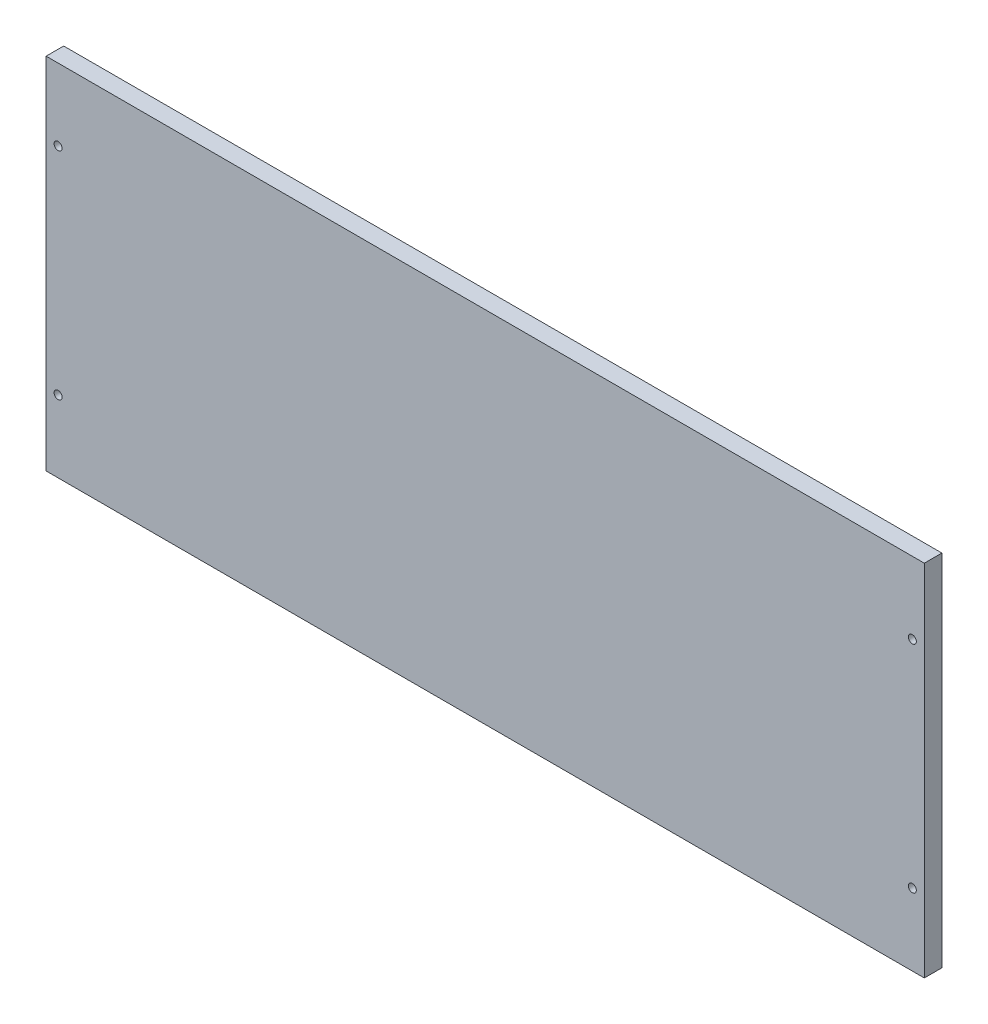
ISO-10303-21;
HEADER;
FILE_DESCRIPTION(('STEP AP214'),'2;1');
FILE_NAME('part.step','',(''),(''),'','','');
FILE_SCHEMA(('AUTOMOTIVE_DESIGN { 1 0 10303 214 1 1 1 1 }'));
ENDSEC;
DATA;
#1=APPLICATION_CONTEXT('core data for automotive mechanical design processes');
#2=APPLICATION_PROTOCOL_DEFINITION('international standard','automotive_design',2000,#1);
#3=PRODUCT_CONTEXT('',#1,'mechanical');
#4=PRODUCT('Part','Part','',(#3));
#5=PRODUCT_RELATED_PRODUCT_CATEGORY('part','',(#4));
#6=PRODUCT_DEFINITION_FORMATION('','',#4);
#7=PRODUCT_DEFINITION_CONTEXT('part definition',#1,'design');
#8=PRODUCT_DEFINITION('design','',#6,#7);
#9=PRODUCT_DEFINITION_SHAPE('','',#8);
#10=(LENGTH_UNIT() NAMED_UNIT(*) SI_UNIT(.MILLI.,.METRE.));
#11=(NAMED_UNIT(*) PLANE_ANGLE_UNIT() SI_UNIT($,.RADIAN.));
#12=(NAMED_UNIT(*) SI_UNIT($,.STERADIAN.) SOLID_ANGLE_UNIT());
#13=UNCERTAINTY_MEASURE_WITH_UNIT(LENGTH_MEASURE(1.E-05),#10,'distance_accuracy_value','');
#14=(GEOMETRIC_REPRESENTATION_CONTEXT(3) GLOBAL_UNCERTAINTY_ASSIGNED_CONTEXT((#13)) GLOBAL_UNIT_ASSIGNED_CONTEXT((#10,
#11,#12)) REPRESENTATION_CONTEXT('',''));
#15=CARTESIAN_POINT('',(0.,0.,0.));
#16=DIRECTION('',(0.,0.,1.));
#17=DIRECTION('',(1.,0.,0.));
#18=AXIS2_PLACEMENT_3D('',#15,#16,#17);
#19=CARTESIAN_POINT('',(550.,-225.,22.));
#20=DIRECTION('',(-1.,0.,0.));
#21=DIRECTION('',(0.,0.,1.));
#22=AXIS2_PLACEMENT_3D('',#19,#20,#21);
#23=PLANE('',#22);
#24=DIRECTION('',(0.,1.,0.));
#25=VECTOR('',#24,1.);
#26=CARTESIAN_POINT('',(550.,-225.,0.));
#27=LINE('',#26,#25);
#28=CARTESIAN_POINT('',(550.,-225.,0.));
#29=VERTEX_POINT('',#28);
#30=CARTESIAN_POINT('',(550.,225.,0.));
#31=VERTEX_POINT('',#30);
#32=EDGE_CURVE('E102',#29,#31,#27,.T.);
#33=ORIENTED_EDGE('',*,*,#32,.T.);
#34=DIRECTION('',(0.,0.,-1.));
#35=VECTOR('',#34,1.);
#36=CARTESIAN_POINT('',(550.,225.,22.));
#37=LINE('',#36,#35);
#38=CARTESIAN_POINT('',(550.,225.,22.));
#39=VERTEX_POINT('',#38);
#40=EDGE_CURVE('E11',#39,#31,#37,.T.);
#41=ORIENTED_EDGE('',*,*,#40,.F.);
#42=DIRECTION('',(0.,1.,0.));
#43=VECTOR('',#42,1.);
#44=CARTESIAN_POINT('',(550.,-225.,22.));
#45=LINE('',#44,#43);
#46=CARTESIAN_POINT('',(550.,-225.,22.));
#47=VERTEX_POINT('',#46);
#48=EDGE_CURVE('E89',#47,#39,#45,.T.);
#49=ORIENTED_EDGE('',*,*,#48,.F.);
#50=DIRECTION('',(0.,0.,-1.));
#51=VECTOR('',#50,1.);
#52=CARTESIAN_POINT('',(550.,-225.,22.));
#53=LINE('',#52,#51);
#54=EDGE_CURVE('E98',#47,#29,#53,.T.);
#55=ORIENTED_EDGE('',*,*,#54,.T.);
#56=EDGE_LOOP('',(#33,#41,#49,#55));
#57=FACE_BOUND('',#56,.T.);
#58=ADVANCED_FACE('F36',(#57),#23,.F.);
#59=CARTESIAN_POINT('',(550.,225.,22.));
#60=DIRECTION('',(0.,-1.,0.));
#61=DIRECTION('',(1.,0.,0.));
#62=AXIS2_PLACEMENT_3D('',#59,#60,#61);
#63=PLANE('',#62);
#64=DIRECTION('',(-1.,0.,0.));
#65=VECTOR('',#64,1.);
#66=CARTESIAN_POINT('',(550.,225.,0.));
#67=LINE('',#66,#65);
#68=CARTESIAN_POINT('',(-550.,225.,0.));
#69=VERTEX_POINT('',#68);
#70=EDGE_CURVE('E93',#31,#69,#67,.T.);
#71=ORIENTED_EDGE('',*,*,#70,.T.);
#72=DIRECTION('',(0.,0.,-1.));
#73=VECTOR('',#72,1.);
#74=CARTESIAN_POINT('',(-550.,225.,22.));
#75=LINE('',#74,#73);
#76=CARTESIAN_POINT('',(-550.,225.,22.));
#77=VERTEX_POINT('',#76);
#78=EDGE_CURVE('E45',#77,#69,#75,.T.);
#79=ORIENTED_EDGE('',*,*,#78,.F.);
#80=DIRECTION('',(-1.,0.,0.));
#81=VECTOR('',#80,1.);
#82=CARTESIAN_POINT('',(550.,225.,22.));
#83=LINE('',#82,#81);
#84=EDGE_CURVE('E84',#39,#77,#83,.T.);
#85=ORIENTED_EDGE('',*,*,#84,.F.);
#86=ORIENTED_EDGE('',*,*,#40,.T.);
#87=EDGE_LOOP('',(#71,#79,#85,#86));
#88=FACE_BOUND('',#87,.T.);
#89=ADVANCED_FACE('F92',(#88),#63,.F.);
#90=CARTESIAN_POINT('',(-550.,-225.,22.));
#91=DIRECTION('',(1.,0.,0.));
#92=DIRECTION('',(0.,0.,-1.));
#93=AXIS2_PLACEMENT_3D('',#90,#91,#92);
#94=PLANE('',#93);
#95=DIRECTION('',(0.,-1.,0.));
#96=VECTOR('',#95,1.);
#97=CARTESIAN_POINT('',(-550.,-225.,0.));
#98=LINE('',#97,#96);
#99=CARTESIAN_POINT('',(-550.,-225.,0.));
#100=VERTEX_POINT('',#99);
#101=EDGE_CURVE('E71',#69,#100,#98,.T.);
#102=ORIENTED_EDGE('',*,*,#101,.T.);
#103=DIRECTION('',(0.,0.,-1.));
#104=VECTOR('',#103,1.);
#105=CARTESIAN_POINT('',(-550.,-225.,22.));
#106=LINE('',#105,#104);
#107=CARTESIAN_POINT('',(-550.,-225.,22.));
#108=VERTEX_POINT('',#107);
#109=EDGE_CURVE('E94',#108,#100,#106,.T.);
#110=ORIENTED_EDGE('',*,*,#109,.F.);
#111=DIRECTION('',(0.,-1.,0.));
#112=VECTOR('',#111,1.);
#113=CARTESIAN_POINT('',(-550.,-225.,22.));
#114=LINE('',#113,#112);
#115=EDGE_CURVE('E87',#77,#108,#114,.T.);
#116=ORIENTED_EDGE('',*,*,#115,.F.);
#117=ORIENTED_EDGE('',*,*,#78,.T.);
#118=EDGE_LOOP('',(#102,#110,#116,#117));
#119=FACE_BOUND('',#118,.T.);
#120=ADVANCED_FACE('F96',(#119),#94,.F.);
#121=CARTESIAN_POINT('',(550.,-225.,22.));
#122=DIRECTION('',(0.,1.,0.));
#123=DIRECTION('',(-1.,0.,0.));
#124=AXIS2_PLACEMENT_3D('',#121,#122,#123);
#125=PLANE('',#124);
#126=DIRECTION('',(1.,0.,0.));
#127=VECTOR('',#126,1.);
#128=CARTESIAN_POINT('',(550.,-225.,0.));
#129=LINE('',#128,#127);
#130=EDGE_CURVE('E77',#100,#29,#129,.T.);
#131=ORIENTED_EDGE('',*,*,#130,.T.);
#132=ORIENTED_EDGE('',*,*,#54,.F.);
#133=DIRECTION('',(1.,0.,0.));
#134=VECTOR('',#133,1.);
#135=CARTESIAN_POINT('',(550.,-225.,22.));
#136=LINE('',#135,#134);
#137=EDGE_CURVE('E54',#108,#47,#136,.T.);
#138=ORIENTED_EDGE('',*,*,#137,.F.);
#139=ORIENTED_EDGE('',*,*,#109,.T.);
#140=EDGE_LOOP('',(#131,#132,#138,#139));
#141=FACE_BOUND('',#140,.T.);
#142=ADVANCED_FACE('F141',(#141),#125,.F.);
#143=CARTESIAN_POINT('',(0.,0.,22.));
#144=DIRECTION('',(0.,0.,1.));
#145=DIRECTION('',(1.,0.,0.));
#146=AXIS2_PLACEMENT_3D('',#143,#144,#145);
#147=PLANE('',#146);
#148=CARTESIAN_POINT('',(-535.,135.,22.));
#149=DIRECTION('',(0.,0.,1.));
#150=DIRECTION('',(1.,0.,0.));
#151=AXIS2_PLACEMENT_3D('',#148,#149,#150);
#152=CIRCLE('',#151,5.);
#153=CARTESIAN_POINT('',(-530.,135.,22.));
#154=VERTEX_POINT('',#153);
#155=EDGE_CURVE('E39',#154,#154,#152,.T.);
#156=ORIENTED_EDGE('',*,*,#155,.F.);
#157=EDGE_LOOP('',(#156));
#158=FACE_BOUND('',#157,.T.);
#159=CARTESIAN_POINT('',(-535.,-135.,22.));
#160=DIRECTION('',(0.,0.,1.));
#161=DIRECTION('',(1.,0.,0.));
#162=AXIS2_PLACEMENT_3D('',#159,#160,#161);
#163=CIRCLE('',#162,5.);
#164=CARTESIAN_POINT('',(-530.,-135.,22.));
#165=VERTEX_POINT('',#164);
#166=EDGE_CURVE('E117',#165,#165,#163,.T.);
#167=ORIENTED_EDGE('',*,*,#166,.F.);
#168=EDGE_LOOP('',(#167));
#169=FACE_BOUND('',#168,.T.);
#170=CARTESIAN_POINT('',(535.,135.,22.));
#171=DIRECTION('',(0.,0.,1.));
#172=DIRECTION('',(1.,0.,0.));
#173=AXIS2_PLACEMENT_3D('',#170,#171,#172);
#174=CIRCLE('',#173,5.);
#175=CARTESIAN_POINT('',(540.,135.,22.));
#176=VERTEX_POINT('',#175);
#177=EDGE_CURVE('E114',#176,#176,#174,.T.);
#178=ORIENTED_EDGE('',*,*,#177,.F.);
#179=EDGE_LOOP('',(#178));
#180=FACE_BOUND('',#179,.T.);
#181=CARTESIAN_POINT('',(535.,-135.,22.));
#182=DIRECTION('',(0.,0.,1.));
#183=DIRECTION('',(1.,0.,0.));
#184=AXIS2_PLACEMENT_3D('',#181,#182,#183);
#185=CIRCLE('',#184,5.);
#186=CARTESIAN_POINT('',(540.,-135.,22.));
#187=VERTEX_POINT('',#186);
#188=EDGE_CURVE('E105',#187,#187,#185,.T.);
#189=ORIENTED_EDGE('',*,*,#188,.F.);
#190=EDGE_LOOP('',(#189));
#191=FACE_BOUND('',#190,.T.);
#192=ORIENTED_EDGE('',*,*,#48,.T.);
#193=ORIENTED_EDGE('',*,*,#84,.T.);
#194=ORIENTED_EDGE('',*,*,#115,.T.);
#195=ORIENTED_EDGE('',*,*,#137,.T.);
#196=EDGE_LOOP('',(#192,#193,#194,#195));
#197=FACE_BOUND('',#196,.T.);
#198=ADVANCED_FACE('F85',(#158,#169,#180,#191,#197),#147,.T.);
#199=CARTESIAN_POINT('',(0.,0.,0.));
#200=DIRECTION('',(0.,0.,1.));
#201=DIRECTION('',(1.,0.,0.));
#202=AXIS2_PLACEMENT_3D('',#199,#200,#201);
#203=PLANE('',#202);
#204=CARTESIAN_POINT('',(-535.,135.,0.));
#205=DIRECTION('',(0.,0.,1.));
#206=DIRECTION('',(1.,0.,0.));
#207=AXIS2_PLACEMENT_3D('',#204,#205,#206);
#208=CIRCLE('',#207,5.);
#209=CARTESIAN_POINT('',(-530.,135.,0.));
#210=VERTEX_POINT('',#209);
#211=EDGE_CURVE('E120',#210,#210,#208,.T.);
#212=ORIENTED_EDGE('',*,*,#211,.T.);
#213=EDGE_LOOP('',(#212));
#214=FACE_BOUND('',#213,.T.);
#215=CARTESIAN_POINT('',(-535.,-135.,0.));
#216=DIRECTION('',(0.,0.,1.));
#217=DIRECTION('',(1.,0.,0.));
#218=AXIS2_PLACEMENT_3D('',#215,#216,#217);
#219=CIRCLE('',#218,5.);
#220=CARTESIAN_POINT('',(-530.,-135.,0.));
#221=VERTEX_POINT('',#220);
#222=EDGE_CURVE('E118',#221,#221,#219,.T.);
#223=ORIENTED_EDGE('',*,*,#222,.T.);
#224=EDGE_LOOP('',(#223));
#225=FACE_BOUND('',#224,.T.);
#226=CARTESIAN_POINT('',(535.,135.,0.));
#227=DIRECTION('',(0.,0.,1.));
#228=DIRECTION('',(1.,0.,0.));
#229=AXIS2_PLACEMENT_3D('',#226,#227,#228);
#230=CIRCLE('',#229,5.);
#231=CARTESIAN_POINT('',(540.,135.,0.));
#232=VERTEX_POINT('',#231);
#233=EDGE_CURVE('E115',#232,#232,#230,.T.);
#234=ORIENTED_EDGE('',*,*,#233,.T.);
#235=EDGE_LOOP('',(#234));
#236=FACE_BOUND('',#235,.T.);
#237=CARTESIAN_POINT('',(535.,-135.,0.));
#238=DIRECTION('',(0.,0.,1.));
#239=DIRECTION('',(1.,0.,0.));
#240=AXIS2_PLACEMENT_3D('',#237,#238,#239);
#241=CIRCLE('',#240,5.);
#242=CARTESIAN_POINT('',(540.,-135.,0.));
#243=VERTEX_POINT('',#242);
#244=EDGE_CURVE('E111',#243,#243,#241,.T.);
#245=ORIENTED_EDGE('',*,*,#244,.T.);
#246=EDGE_LOOP('',(#245));
#247=FACE_BOUND('',#246,.T.);
#248=ORIENTED_EDGE('',*,*,#32,.F.);
#249=ORIENTED_EDGE('',*,*,#130,.F.);
#250=ORIENTED_EDGE('',*,*,#101,.F.);
#251=ORIENTED_EDGE('',*,*,#70,.F.);
#252=EDGE_LOOP('',(#248,#249,#250,#251));
#253=FACE_BOUND('',#252,.T.);
#254=ADVANCED_FACE('F140',(#214,#225,#236,#247,#253),#203,.F.);
#255=CARTESIAN_POINT('',(535.,-135.,-30.0000000000002));
#256=DIRECTION('',(0.,0.,-1.));
#257=DIRECTION('',(0.,1.,0.));
#258=AXIS2_PLACEMENT_3D('',#255,#256,#257);
#259=CYLINDRICAL_SURFACE('',#258,5.);
#260=ORIENTED_EDGE('',*,*,#188,.T.);
#261=EDGE_LOOP('',(#260));
#262=FACE_BOUND('',#261,.T.);
#263=ORIENTED_EDGE('',*,*,#244,.F.);
#264=EDGE_LOOP('',(#263));
#265=FACE_BOUND('',#264,.T.);
#266=ADVANCED_FACE('F136',(#262,#265),#259,.F.);
#267=CARTESIAN_POINT('',(535.,135.,-30.0000000000002));
#268=DIRECTION('',(0.,0.,-1.));
#269=DIRECTION('',(0.,1.,0.));
#270=AXIS2_PLACEMENT_3D('',#267,#268,#269);
#271=CYLINDRICAL_SURFACE('',#270,5.);
#272=ORIENTED_EDGE('',*,*,#177,.T.);
#273=EDGE_LOOP('',(#272));
#274=FACE_BOUND('',#273,.T.);
#275=ORIENTED_EDGE('',*,*,#233,.F.);
#276=EDGE_LOOP('',(#275));
#277=FACE_BOUND('',#276,.T.);
#278=ADVANCED_FACE('F189',(#274,#277),#271,.F.);
#279=CARTESIAN_POINT('',(-535.,-135.,-30.0000000000001));
#280=DIRECTION('',(0.,0.,-1.));
#281=DIRECTION('',(0.,1.,0.));
#282=AXIS2_PLACEMENT_3D('',#279,#280,#281);
#283=CYLINDRICAL_SURFACE('',#282,5.);
#284=ORIENTED_EDGE('',*,*,#166,.T.);
#285=EDGE_LOOP('',(#284));
#286=FACE_BOUND('',#285,.T.);
#287=ORIENTED_EDGE('',*,*,#222,.F.);
#288=EDGE_LOOP('',(#287));
#289=FACE_BOUND('',#288,.T.);
#290=ADVANCED_FACE('F194',(#286,#289),#283,.F.);
#291=CARTESIAN_POINT('',(-535.,135.,-30.));
#292=DIRECTION('',(0.,0.,-1.));
#293=DIRECTION('',(0.,1.,0.));
#294=AXIS2_PLACEMENT_3D('',#291,#292,#293);
#295=CYLINDRICAL_SURFACE('',#294,5.);
#296=ORIENTED_EDGE('',*,*,#155,.T.);
#297=EDGE_LOOP('',(#296));
#298=FACE_BOUND('',#297,.T.);
#299=ORIENTED_EDGE('',*,*,#211,.F.);
#300=EDGE_LOOP('',(#299));
#301=FACE_BOUND('',#300,.T.);
#302=ADVANCED_FACE('F202',(#298,#301),#295,.F.);
#303=CLOSED_SHELL('',(#58,#89,#120,#142,#198,#254,#266,#278,#290,#302));
#304=MANIFOLD_SOLID_BREP('B2',#303);
#305=ADVANCED_BREP_SHAPE_REPRESENTATION('',(#18,#304),#14);
#306=SHAPE_DEFINITION_REPRESENTATION(#9,#305);
ENDSEC;
END-ISO-10303-21;
